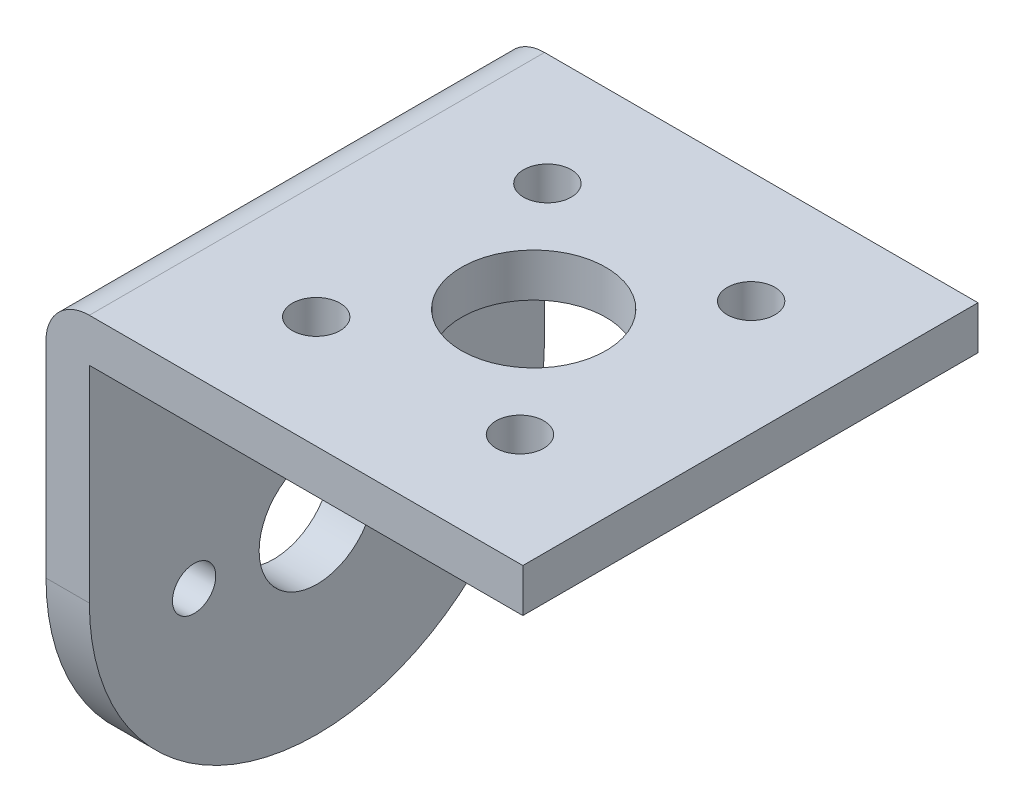
ISO-10303-21;
HEADER;
FILE_DESCRIPTION(('STEP AP214'),'2;1');
FILE_NAME('part.step','',(''),(''),'','','');
FILE_SCHEMA(('AUTOMOTIVE_DESIGN { 1 0 10303 214 1 1 1 1 }'));
ENDSEC;
DATA;
#1=APPLICATION_CONTEXT('core data for automotive mechanical design processes');
#2=APPLICATION_PROTOCOL_DEFINITION('international standard','automotive_design',2000,#1);
#3=PRODUCT_CONTEXT('',#1,'mechanical');
#4=PRODUCT('Part','Part','',(#3));
#5=PRODUCT_RELATED_PRODUCT_CATEGORY('part','',(#4));
#6=PRODUCT_DEFINITION_FORMATION('','',#4);
#7=PRODUCT_DEFINITION_CONTEXT('part definition',#1,'design');
#8=PRODUCT_DEFINITION('design','',#6,#7);
#9=PRODUCT_DEFINITION_SHAPE('','',#8);
#10=(LENGTH_UNIT() NAMED_UNIT(*) SI_UNIT(.MILLI.,.METRE.));
#11=(NAMED_UNIT(*) PLANE_ANGLE_UNIT() SI_UNIT($,.RADIAN.));
#12=(NAMED_UNIT(*) SI_UNIT($,.STERADIAN.) SOLID_ANGLE_UNIT());
#13=UNCERTAINTY_MEASURE_WITH_UNIT(LENGTH_MEASURE(1.E-05),#10,'distance_accuracy_value','');
#14=(GEOMETRIC_REPRESENTATION_CONTEXT(3) GLOBAL_UNCERTAINTY_ASSIGNED_CONTEXT((#13)) GLOBAL_UNIT_ASSIGNED_CONTEXT((#10,
#11,#12)) REPRESENTATION_CONTEXT('',''));
#15=CARTESIAN_POINT('',(0.,0.,0.));
#16=DIRECTION('',(0.,0.,1.));
#17=DIRECTION('',(1.,0.,0.));
#18=AXIS2_PLACEMENT_3D('',#15,#16,#17);
#19=CARTESIAN_POINT('',(0.,3.,0.));
#20=DIRECTION('',(0.,-1.,0.));
#21=DIRECTION('',(0.,0.,-1.));
#22=AXIS2_PLACEMENT_3D('',#19,#20,#21);
#23=PLANE('',#22);
#24=DIRECTION('',(-1.,0.,0.));
#25=VECTOR('',#24,1.);
#26=CARTESIAN_POINT('',(0.,3.,-31.5));
#27=LINE('',#26,#25);
#28=CARTESIAN_POINT('',(33.,3.,-31.5));
#29=VERTEX_POINT('',#28);
#30=CARTESIAN_POINT('',(3.,3.,-31.5));
#31=VERTEX_POINT('',#30);
#32=EDGE_CURVE('E170',#29,#31,#27,.T.);
#33=ORIENTED_EDGE('',*,*,#32,.T.);
#34=DIRECTION('',(0.,0.,1.));
#35=VECTOR('',#34,1.);
#36=CARTESIAN_POINT('',(3.,3.,0.));
#37=LINE('',#36,#35);
#38=CARTESIAN_POINT('',(3.,3.,0.));
#39=VERTEX_POINT('',#38);
#40=EDGE_CURVE('E203',#31,#39,#37,.T.);
#41=ORIENTED_EDGE('',*,*,#40,.T.);
#42=DIRECTION('',(1.,0.,0.));
#43=VECTOR('',#42,1.);
#44=CARTESIAN_POINT('',(0.,3.,0.));
#45=LINE('',#44,#43);
#46=CARTESIAN_POINT('',(33.,3.,0.));
#47=VERTEX_POINT('',#46);
#48=EDGE_CURVE('E165',#39,#47,#45,.T.);
#49=ORIENTED_EDGE('',*,*,#48,.T.);
#50=DIRECTION('',(0.,0.,-1.));
#51=VECTOR('',#50,1.);
#52=CARTESIAN_POINT('',(33.,3.,0.));
#53=LINE('',#52,#51);
#54=EDGE_CURVE('E167',#47,#29,#53,.T.);
#55=ORIENTED_EDGE('',*,*,#54,.T.);
#56=EDGE_LOOP('',(#33,#41,#49,#55));
#57=FACE_BOUND('',#56,.T.);
#58=CARTESIAN_POINT('',(18.,3.,-15.75));
#59=DIRECTION('',(0.,1.,0.));
#60=DIRECTION('',(0.,0.,1.));
#61=AXIS2_PLACEMENT_3D('',#58,#59,#60);
#62=CIRCLE('',#61,5.);
#63=CARTESIAN_POINT('',(18.,3.,-10.75));
#64=VERTEX_POINT('',#63);
#65=EDGE_CURVE('E122',#64,#64,#62,.T.);
#66=ORIENTED_EDGE('',*,*,#65,.F.);
#67=EDGE_LOOP('',(#66));
#68=FACE_BOUND('',#67,.T.);
#69=CARTESIAN_POINT('',(25.05,3.,-23.75));
#70=DIRECTION('',(0.,1.,0.));
#71=DIRECTION('',(0.,0.,1.));
#72=AXIS2_PLACEMENT_3D('',#69,#70,#71);
#73=CIRCLE('',#72,1.65);
#74=CARTESIAN_POINT('',(25.05,3.,-22.1));
#75=VERTEX_POINT('',#74);
#76=EDGE_CURVE('E155',#75,#75,#73,.T.);
#77=ORIENTED_EDGE('',*,*,#76,.F.);
#78=EDGE_LOOP('',(#77));
#79=FACE_BOUND('',#78,.T.);
#80=CARTESIAN_POINT('',(10.95,3.,-23.75));
#81=DIRECTION('',(0.,1.,0.));
#82=DIRECTION('',(0.,0.,1.));
#83=AXIS2_PLACEMENT_3D('',#80,#81,#82);
#84=CIRCLE('',#83,1.65);
#85=CARTESIAN_POINT('',(10.95,3.,-22.1));
#86=VERTEX_POINT('',#85);
#87=EDGE_CURVE('E149',#86,#86,#84,.T.);
#88=ORIENTED_EDGE('',*,*,#87,.F.);
#89=EDGE_LOOP('',(#88));
#90=FACE_BOUND('',#89,.T.);
#91=CARTESIAN_POINT('',(25.05,3.,-7.75));
#92=DIRECTION('',(0.,1.,0.));
#93=DIRECTION('',(0.,0.,-1.));
#94=AXIS2_PLACEMENT_3D('',#91,#92,#93);
#95=CIRCLE('',#94,1.65);
#96=CARTESIAN_POINT('',(25.05,3.,-9.4));
#97=VERTEX_POINT('',#96);
#98=EDGE_CURVE('E143',#97,#97,#95,.T.);
#99=ORIENTED_EDGE('',*,*,#98,.F.);
#100=EDGE_LOOP('',(#99));
#101=FACE_BOUND('',#100,.T.);
#102=CARTESIAN_POINT('',(10.95,3.,-7.75));
#103=DIRECTION('',(0.,1.,0.));
#104=DIRECTION('',(0.,0.,-1.));
#105=AXIS2_PLACEMENT_3D('',#102,#103,#104);
#106=CIRCLE('',#105,1.65);
#107=CARTESIAN_POINT('',(10.95,3.,-9.4));
#108=VERTEX_POINT('',#107);
#109=EDGE_CURVE('E137',#108,#108,#106,.T.);
#110=ORIENTED_EDGE('',*,*,#109,.F.);
#111=EDGE_LOOP('',(#110));
#112=FACE_BOUND('',#111,.T.);
#113=ADVANCED_FACE('F39',(#57,#68,#79,#90,#101,#112),#23,.F.);
#114=CARTESIAN_POINT('',(0.,0.,0.));
#115=DIRECTION('',(0.,-1.,0.));
#116=DIRECTION('',(0.,0.,-1.));
#117=AXIS2_PLACEMENT_3D('',#114,#115,#116);
#118=PLANE('',#117);
#119=DIRECTION('',(0.,0.,1.));
#120=VECTOR('',#119,1.);
#121=CARTESIAN_POINT('',(3.,0.,0.));
#122=LINE('',#121,#120);
#123=CARTESIAN_POINT('',(3.,0.,-31.5));
#124=VERTEX_POINT('',#123);
#125=CARTESIAN_POINT('',(3.,0.,0.));
#126=VERTEX_POINT('',#125);
#127=EDGE_CURVE('E112',#124,#126,#122,.T.);
#128=ORIENTED_EDGE('',*,*,#127,.F.);
#129=DIRECTION('',(-1.,0.,0.));
#130=VECTOR('',#129,1.);
#131=CARTESIAN_POINT('',(0.,0.,-31.5));
#132=LINE('',#131,#130);
#133=CARTESIAN_POINT('',(33.,0.,-31.5));
#134=VERTEX_POINT('',#133);
#135=EDGE_CURVE('E168',#134,#124,#132,.T.);
#136=ORIENTED_EDGE('',*,*,#135,.F.);
#137=DIRECTION('',(0.,0.,-1.));
#138=VECTOR('',#137,1.);
#139=CARTESIAN_POINT('',(33.,0.,0.));
#140=LINE('',#139,#138);
#141=CARTESIAN_POINT('',(33.,0.,0.));
#142=VERTEX_POINT('',#141);
#143=EDGE_CURVE('E121',#142,#134,#140,.T.);
#144=ORIENTED_EDGE('',*,*,#143,.F.);
#145=DIRECTION('',(1.,0.,0.));
#146=VECTOR('',#145,1.);
#147=CARTESIAN_POINT('',(0.,0.,0.));
#148=LINE('',#147,#146);
#149=EDGE_CURVE('E105',#126,#142,#148,.T.);
#150=ORIENTED_EDGE('',*,*,#149,.F.);
#151=EDGE_LOOP('',(#128,#136,#144,#150));
#152=FACE_BOUND('',#151,.T.);
#153=CARTESIAN_POINT('',(25.05,0.,-7.75));
#154=DIRECTION('',(0.,1.,0.));
#155=DIRECTION('',(0.,0.,-1.));
#156=AXIS2_PLACEMENT_3D('',#153,#154,#155);
#157=CIRCLE('',#156,1.65);
#158=CARTESIAN_POINT('',(25.05,0.,-9.4));
#159=VERTEX_POINT('',#158);
#160=EDGE_CURVE('E140',#159,#159,#157,.T.);
#161=ORIENTED_EDGE('',*,*,#160,.T.);
#162=EDGE_LOOP('',(#161));
#163=FACE_BOUND('',#162,.T.);
#164=CARTESIAN_POINT('',(25.05,0.,-23.75));
#165=DIRECTION('',(0.,1.,0.));
#166=DIRECTION('',(0.,0.,1.));
#167=AXIS2_PLACEMENT_3D('',#164,#165,#166);
#168=CIRCLE('',#167,1.65);
#169=CARTESIAN_POINT('',(25.05,0.,-22.1));
#170=VERTEX_POINT('',#169);
#171=EDGE_CURVE('E152',#170,#170,#168,.T.);
#172=ORIENTED_EDGE('',*,*,#171,.T.);
#173=EDGE_LOOP('',(#172));
#174=FACE_BOUND('',#173,.T.);
#175=CARTESIAN_POINT('',(18.,0.,-15.75));
#176=DIRECTION('',(0.,1.,0.));
#177=DIRECTION('',(0.,0.,1.));
#178=AXIS2_PLACEMENT_3D('',#175,#176,#177);
#179=CIRCLE('',#178,5.);
#180=CARTESIAN_POINT('',(18.,0.,-10.75));
#181=VERTEX_POINT('',#180);
#182=EDGE_CURVE('E158',#181,#181,#179,.T.);
#183=ORIENTED_EDGE('',*,*,#182,.T.);
#184=EDGE_LOOP('',(#183));
#185=FACE_BOUND('',#184,.T.);
#186=CARTESIAN_POINT('',(10.95,0.,-23.75));
#187=DIRECTION('',(0.,1.,0.));
#188=DIRECTION('',(0.,0.,1.));
#189=AXIS2_PLACEMENT_3D('',#186,#187,#188);
#190=CIRCLE('',#189,1.65);
#191=CARTESIAN_POINT('',(10.95,0.,-22.1));
#192=VERTEX_POINT('',#191);
#193=EDGE_CURVE('E146',#192,#192,#190,.T.);
#194=ORIENTED_EDGE('',*,*,#193,.T.);
#195=EDGE_LOOP('',(#194));
#196=FACE_BOUND('',#195,.T.);
#197=CARTESIAN_POINT('',(10.95,0.,-7.75));
#198=DIRECTION('',(0.,1.,0.));
#199=DIRECTION('',(0.,0.,-1.));
#200=AXIS2_PLACEMENT_3D('',#197,#198,#199);
#201=CIRCLE('',#200,1.65);
#202=CARTESIAN_POINT('',(10.95,0.,-9.4));
#203=VERTEX_POINT('',#202);
#204=EDGE_CURVE('E136',#203,#203,#201,.T.);
#205=ORIENTED_EDGE('',*,*,#204,.T.);
#206=EDGE_LOOP('',(#205));
#207=FACE_BOUND('',#206,.T.);
#208=ADVANCED_FACE('F117',(#152,#163,#174,#185,#196,#207),#118,.T.);
#209=CARTESIAN_POINT('',(0.,3.,0.));
#210=DIRECTION('',(1.,0.,0.));
#211=DIRECTION('',(0.,0.,-1.));
#212=AXIS2_PLACEMENT_3D('',#209,#210,#211);
#213=PLANE('',#212);
#214=CARTESIAN_POINT('',(0.,-17.,-24.25));
#215=DIRECTION('',(-1.,0.,0.));
#216=DIRECTION('',(0.,0.,1.));
#217=AXIS2_PLACEMENT_3D('',#214,#215,#216);
#218=CIRCLE('',#217,1.5);
#219=CARTESIAN_POINT('',(0.,-17.,-22.75));
#220=VERTEX_POINT('',#219);
#221=EDGE_CURVE('E188',#220,#220,#218,.T.);
#222=ORIENTED_EDGE('',*,*,#221,.F.);
#223=EDGE_LOOP('',(#222));
#224=FACE_BOUND('',#223,.T.);
#225=CARTESIAN_POINT('',(0.,-17.,-7.25));
#226=DIRECTION('',(-1.,0.,0.));
#227=DIRECTION('',(0.,0.,1.));
#228=AXIS2_PLACEMENT_3D('',#225,#226,#227);
#229=CIRCLE('',#228,1.5);
#230=CARTESIAN_POINT('',(0.,-17.,-5.75));
#231=VERTEX_POINT('',#230);
#232=EDGE_CURVE('E435',#231,#231,#229,.T.);
#233=ORIENTED_EDGE('',*,*,#232,.F.);
#234=EDGE_LOOP('',(#233));
#235=FACE_BOUND('',#234,.T.);
#236=CARTESIAN_POINT('',(0.,-17.,-15.75));
#237=DIRECTION('',(-1.,0.,0.));
#238=DIRECTION('',(0.,0.,1.));
#239=AXIS2_PLACEMENT_3D('',#236,#237,#238);
#240=CIRCLE('',#239,4.);
#241=CARTESIAN_POINT('',(0.,-17.,-11.75));
#242=VERTEX_POINT('',#241);
#243=EDGE_CURVE('E132',#242,#242,#240,.T.);
#244=ORIENTED_EDGE('',*,*,#243,.F.);
#245=EDGE_LOOP('',(#244));
#246=FACE_BOUND('',#245,.T.);
#247=DIRECTION('',(0.,-1.,0.));
#248=VECTOR('',#247,1.);
#249=CARTESIAN_POINT('',(0.,3.,0.));
#250=LINE('',#249,#248);
#251=CARTESIAN_POINT('',(0.,0.,0.));
#252=VERTEX_POINT('',#251);
#253=CARTESIAN_POINT('',(0.,-14.25,0.));
#254=VERTEX_POINT('',#253);
#255=EDGE_CURVE('E182',#252,#254,#250,.T.);
#256=ORIENTED_EDGE('',*,*,#255,.F.);
#257=DIRECTION('',(0.,0.,1.));
#258=VECTOR('',#257,1.);
#259=CARTESIAN_POINT('',(0.,0.,0.));
#260=LINE('',#259,#258);
#261=CARTESIAN_POINT('',(0.,0.,-31.5));
#262=VERTEX_POINT('',#261);
#263=EDGE_CURVE('E47',#252,#262,#260,.F.);
#264=ORIENTED_EDGE('',*,*,#263,.T.);
#265=DIRECTION('',(0.,-1.,0.));
#266=VECTOR('',#265,1.);
#267=CARTESIAN_POINT('',(0.,3.,-31.5));
#268=LINE('',#267,#266);
#269=CARTESIAN_POINT('',(0.,-14.25,-31.5));
#270=VERTEX_POINT('',#269);
#271=EDGE_CURVE('E172',#262,#270,#268,.T.);
#272=ORIENTED_EDGE('',*,*,#271,.T.);
#273=CARTESIAN_POINT('',(0.,-14.25,-15.75));
#274=DIRECTION('',(1.,0.,0.));
#275=DIRECTION('',(0.,0.,-1.));
#276=AXIS2_PLACEMENT_3D('',#273,#274,#275);
#277=CIRCLE('',#276,15.75);
#278=CARTESIAN_POINT('',(0.,-30.,-15.75));
#279=VERTEX_POINT('',#278);
#280=EDGE_CURVE('E184',#270,#279,#277,.F.);
#281=ORIENTED_EDGE('',*,*,#280,.T.);
#282=CARTESIAN_POINT('',(0.,-14.25,-15.75));
#283=DIRECTION('',(1.,0.,0.));
#284=DIRECTION('',(0.,0.,-1.));
#285=AXIS2_PLACEMENT_3D('',#282,#283,#284);
#286=CIRCLE('',#285,15.75);
#287=EDGE_CURVE('E192',#279,#254,#286,.F.);
#288=ORIENTED_EDGE('',*,*,#287,.T.);
#289=EDGE_LOOP('',(#256,#264,#272,#281,#288));
#290=FACE_BOUND('',#289,.T.);
#291=ADVANCED_FACE('F236',(#224,#235,#246,#290),#213,.F.);
#292=CARTESIAN_POINT('',(0.,3.,0.));
#293=DIRECTION('',(0.,0.,-1.));
#294=DIRECTION('',(-1.,0.,0.));
#295=AXIS2_PLACEMENT_3D('',#292,#293,#294);
#296=PLANE('',#295);
#297=ORIENTED_EDGE('',*,*,#48,.F.);
#298=CARTESIAN_POINT('',(3.,0.,0.));
#299=DIRECTION('',(0.,0.,-1.));
#300=DIRECTION('',(-1.,0.,0.));
#301=AXIS2_PLACEMENT_3D('',#298,#299,#300);
#302=CIRCLE('',#301,3.);
#303=EDGE_CURVE('E61',#39,#252,#302,.F.);
#304=ORIENTED_EDGE('',*,*,#303,.T.);
#305=ORIENTED_EDGE('',*,*,#255,.T.);
#306=DIRECTION('',(-1.,0.,0.));
#307=VECTOR('',#306,1.);
#308=CARTESIAN_POINT('',(3.,-14.25,0.));
#309=LINE('',#308,#307);
#310=CARTESIAN_POINT('',(3.,-14.25,0.));
#311=VERTEX_POINT('',#310);
#312=EDGE_CURVE('E108',#254,#311,#309,.F.);
#313=ORIENTED_EDGE('',*,*,#312,.T.);
#314=DIRECTION('',(0.,1.,0.));
#315=VECTOR('',#314,1.);
#316=CARTESIAN_POINT('',(3.,-30.,0.));
#317=LINE('',#316,#315);
#318=EDGE_CURVE('E101',#311,#126,#317,.T.);
#319=ORIENTED_EDGE('',*,*,#318,.T.);
#320=ORIENTED_EDGE('',*,*,#149,.T.);
#321=DIRECTION('',(0.,-1.,0.));
#322=VECTOR('',#321,1.);
#323=CARTESIAN_POINT('',(33.,3.,0.));
#324=LINE('',#323,#322);
#325=EDGE_CURVE('E180',#47,#142,#324,.T.);
#326=ORIENTED_EDGE('',*,*,#325,.F.);
#327=EDGE_LOOP('',(#297,#304,#305,#313,#319,#320,#326));
#328=FACE_BOUND('',#327,.T.);
#329=ADVANCED_FACE('F103',(#328),#296,.F.);
#330=CARTESIAN_POINT('',(33.,3.,0.));
#331=DIRECTION('',(-1.,0.,0.));
#332=DIRECTION('',(0.,0.,1.));
#333=AXIS2_PLACEMENT_3D('',#330,#331,#332);
#334=PLANE('',#333);
#335=ORIENTED_EDGE('',*,*,#143,.T.);
#336=DIRECTION('',(0.,-1.,0.));
#337=VECTOR('',#336,1.);
#338=CARTESIAN_POINT('',(33.,3.,-31.5));
#339=LINE('',#338,#337);
#340=EDGE_CURVE('E177',#29,#134,#339,.T.);
#341=ORIENTED_EDGE('',*,*,#340,.F.);
#342=ORIENTED_EDGE('',*,*,#54,.F.);
#343=ORIENTED_EDGE('',*,*,#325,.T.);
#344=EDGE_LOOP('',(#335,#341,#342,#343));
#345=FACE_BOUND('',#344,.T.);
#346=ADVANCED_FACE('F218',(#345),#334,.F.);
#347=CARTESIAN_POINT('',(0.,3.,-31.5));
#348=DIRECTION('',(0.,0.,1.));
#349=DIRECTION('',(1.,0.,0.));
#350=AXIS2_PLACEMENT_3D('',#347,#348,#349);
#351=PLANE('',#350);
#352=ORIENTED_EDGE('',*,*,#271,.F.);
#353=CARTESIAN_POINT('',(3.,0.,-31.5));
#354=DIRECTION('',(0.,0.,1.));
#355=DIRECTION('',(1.,0.,0.));
#356=AXIS2_PLACEMENT_3D('',#353,#354,#355);
#357=CIRCLE('',#356,3.);
#358=EDGE_CURVE('E11',#262,#31,#357,.F.);
#359=ORIENTED_EDGE('',*,*,#358,.T.);
#360=ORIENTED_EDGE('',*,*,#32,.F.);
#361=ORIENTED_EDGE('',*,*,#340,.T.);
#362=ORIENTED_EDGE('',*,*,#135,.T.);
#363=DIRECTION('',(0.,1.,0.));
#364=VECTOR('',#363,1.);
#365=CARTESIAN_POINT('',(3.,-30.,-31.5));
#366=LINE('',#365,#364);
#367=CARTESIAN_POINT('',(3.,-14.25,-31.5));
#368=VERTEX_POINT('',#367);
#369=EDGE_CURVE('E111',#368,#124,#366,.T.);
#370=ORIENTED_EDGE('',*,*,#369,.F.);
#371=DIRECTION('',(1.,0.,0.));
#372=VECTOR('',#371,1.);
#373=CARTESIAN_POINT('',(0.,-14.25,-31.5));
#374=LINE('',#373,#372);
#375=EDGE_CURVE('E200',#368,#270,#374,.F.);
#376=ORIENTED_EDGE('',*,*,#375,.T.);
#377=EDGE_LOOP('',(#352,#359,#360,#361,#362,#370,#376));
#378=FACE_BOUND('',#377,.T.);
#379=ADVANCED_FACE('F220',(#378),#351,.F.);
#380=CARTESIAN_POINT('',(18.,3.,-15.75));
#381=DIRECTION('',(0.,-1.,0.));
#382=DIRECTION('',(0.,0.,-1.));
#383=AXIS2_PLACEMENT_3D('',#380,#381,#382);
#384=CYLINDRICAL_SURFACE('',#383,5.);
#385=ORIENTED_EDGE('',*,*,#65,.T.);
#386=EDGE_LOOP('',(#385));
#387=FACE_BOUND('',#386,.T.);
#388=ORIENTED_EDGE('',*,*,#182,.F.);
#389=EDGE_LOOP('',(#388));
#390=FACE_BOUND('',#389,.T.);
#391=ADVANCED_FACE('F239',(#387,#390),#384,.F.);
#392=CARTESIAN_POINT('',(25.05,3.,-23.75));
#393=DIRECTION('',(0.,-1.,0.));
#394=DIRECTION('',(0.,0.,-1.));
#395=AXIS2_PLACEMENT_3D('',#392,#393,#394);
#396=CYLINDRICAL_SURFACE('',#395,1.65);
#397=ORIENTED_EDGE('',*,*,#76,.T.);
#398=EDGE_LOOP('',(#397));
#399=FACE_BOUND('',#398,.T.);
#400=ORIENTED_EDGE('',*,*,#171,.F.);
#401=EDGE_LOOP('',(#400));
#402=FACE_BOUND('',#401,.T.);
#403=ADVANCED_FACE('F287',(#399,#402),#396,.F.);
#404=CARTESIAN_POINT('',(10.95,3.,-23.75));
#405=DIRECTION('',(0.,-1.,0.));
#406=DIRECTION('',(0.,0.,-1.));
#407=AXIS2_PLACEMENT_3D('',#404,#405,#406);
#408=CYLINDRICAL_SURFACE('',#407,1.65);
#409=ORIENTED_EDGE('',*,*,#87,.T.);
#410=EDGE_LOOP('',(#409));
#411=FACE_BOUND('',#410,.T.);
#412=ORIENTED_EDGE('',*,*,#193,.F.);
#413=EDGE_LOOP('',(#412));
#414=FACE_BOUND('',#413,.T.);
#415=ADVANCED_FACE('F284',(#411,#414),#408,.F.);
#416=CARTESIAN_POINT('',(25.05,3.,-7.75));
#417=DIRECTION('',(0.,-1.,0.));
#418=DIRECTION('',(0.,0.,-1.));
#419=AXIS2_PLACEMENT_3D('',#416,#417,#418);
#420=CYLINDRICAL_SURFACE('',#419,1.65);
#421=ORIENTED_EDGE('',*,*,#98,.T.);
#422=EDGE_LOOP('',(#421));
#423=FACE_BOUND('',#422,.T.);
#424=ORIENTED_EDGE('',*,*,#160,.F.);
#425=EDGE_LOOP('',(#424));
#426=FACE_BOUND('',#425,.T.);
#427=ADVANCED_FACE('F280',(#423,#426),#420,.F.);
#428=CARTESIAN_POINT('',(10.95,3.,-7.75));
#429=DIRECTION('',(0.,-1.,0.));
#430=DIRECTION('',(0.,0.,-1.));
#431=AXIS2_PLACEMENT_3D('',#428,#429,#430);
#432=CYLINDRICAL_SURFACE('',#431,1.65);
#433=ORIENTED_EDGE('',*,*,#109,.T.);
#434=EDGE_LOOP('',(#433));
#435=FACE_BOUND('',#434,.T.);
#436=ORIENTED_EDGE('',*,*,#204,.F.);
#437=EDGE_LOOP('',(#436));
#438=FACE_BOUND('',#437,.T.);
#439=ADVANCED_FACE('F276',(#435,#438),#432,.F.);
#440=CARTESIAN_POINT('',(3.,-30.,0.));
#441=DIRECTION('',(-1.,0.,0.));
#442=DIRECTION('',(0.,0.,1.));
#443=AXIS2_PLACEMENT_3D('',#440,#441,#442);
#444=PLANE('',#443);
#445=CARTESIAN_POINT('',(3.,-17.,-24.25));
#446=DIRECTION('',(-1.,0.,0.));
#447=DIRECTION('',(0.,0.,1.));
#448=AXIS2_PLACEMENT_3D('',#445,#446,#447);
#449=CIRCLE('',#448,1.5);
#450=CARTESIAN_POINT('',(3.,-17.,-22.75));
#451=VERTEX_POINT('',#450);
#452=EDGE_CURVE('E126',#451,#451,#449,.T.);
#453=ORIENTED_EDGE('',*,*,#452,.T.);
#454=EDGE_LOOP('',(#453));
#455=FACE_BOUND('',#454,.T.);
#456=CARTESIAN_POINT('',(3.,-17.,-7.25));
#457=DIRECTION('',(-1.,0.,0.));
#458=DIRECTION('',(0.,0.,1.));
#459=AXIS2_PLACEMENT_3D('',#456,#457,#458);
#460=CIRCLE('',#459,1.5);
#461=CARTESIAN_POINT('',(3.,-17.,-5.75));
#462=VERTEX_POINT('',#461);
#463=EDGE_CURVE('E129',#462,#462,#460,.T.);
#464=ORIENTED_EDGE('',*,*,#463,.T.);
#465=EDGE_LOOP('',(#464));
#466=FACE_BOUND('',#465,.T.);
#467=CARTESIAN_POINT('',(3.,-17.,-15.75));
#468=DIRECTION('',(-1.,0.,0.));
#469=DIRECTION('',(0.,0.,1.));
#470=AXIS2_PLACEMENT_3D('',#467,#468,#469);
#471=CIRCLE('',#470,4.);
#472=CARTESIAN_POINT('',(3.,-17.,-11.75));
#473=VERTEX_POINT('',#472);
#474=EDGE_CURVE('E185',#473,#473,#471,.T.);
#475=ORIENTED_EDGE('',*,*,#474,.T.);
#476=EDGE_LOOP('',(#475));
#477=FACE_BOUND('',#476,.T.);
#478=ORIENTED_EDGE('',*,*,#318,.F.);
#479=CARTESIAN_POINT('',(3.,-14.25,-15.75));
#480=DIRECTION('',(-1.,0.,0.));
#481=DIRECTION('',(0.,0.,1.));
#482=AXIS2_PLACEMENT_3D('',#479,#480,#481);
#483=CIRCLE('',#482,15.75);
#484=CARTESIAN_POINT('',(3.,-30.,-15.75));
#485=VERTEX_POINT('',#484);
#486=EDGE_CURVE('E198',#311,#485,#483,.F.);
#487=ORIENTED_EDGE('',*,*,#486,.T.);
#488=CARTESIAN_POINT('',(3.,-14.25,-15.75));
#489=DIRECTION('',(-1.,0.,0.));
#490=DIRECTION('',(0.,0.,1.));
#491=AXIS2_PLACEMENT_3D('',#488,#489,#490);
#492=CIRCLE('',#491,15.75);
#493=EDGE_CURVE('E196',#485,#368,#492,.F.);
#494=ORIENTED_EDGE('',*,*,#493,.T.);
#495=ORIENTED_EDGE('',*,*,#369,.T.);
#496=ORIENTED_EDGE('',*,*,#127,.T.);
#497=EDGE_LOOP('',(#478,#487,#494,#495,#496));
#498=FACE_BOUND('',#497,.T.);
#499=ADVANCED_FACE('F124',(#455,#466,#477,#498),#444,.F.);
#500=CARTESIAN_POINT('',(30.,-17.,-15.75));
#501=DIRECTION('',(-1.,0.,0.));
#502=DIRECTION('',(0.,0.,1.));
#503=AXIS2_PLACEMENT_3D('',#500,#501,#502);
#504=CYLINDRICAL_SURFACE('',#503,4.);
#505=ORIENTED_EDGE('',*,*,#243,.T.);
#506=EDGE_LOOP('',(#505));
#507=FACE_BOUND('',#506,.T.);
#508=ORIENTED_EDGE('',*,*,#474,.F.);
#509=EDGE_LOOP('',(#508));
#510=FACE_BOUND('',#509,.T.);
#511=ADVANCED_FACE('F266',(#507,#510),#504,.F.);
#512=CARTESIAN_POINT('',(30.,-17.,-7.25));
#513=DIRECTION('',(-1.,0.,0.));
#514=DIRECTION('',(0.,0.,1.));
#515=AXIS2_PLACEMENT_3D('',#512,#513,#514);
#516=CYLINDRICAL_SURFACE('',#515,1.5);
#517=ORIENTED_EDGE('',*,*,#232,.T.);
#518=EDGE_LOOP('',(#517));
#519=FACE_BOUND('',#518,.T.);
#520=ORIENTED_EDGE('',*,*,#463,.F.);
#521=EDGE_LOOP('',(#520));
#522=FACE_BOUND('',#521,.T.);
#523=ADVANCED_FACE('F255',(#519,#522),#516,.F.);
#524=CARTESIAN_POINT('',(30.,-17.,-24.25));
#525=DIRECTION('',(-1.,0.,0.));
#526=DIRECTION('',(0.,0.,1.));
#527=AXIS2_PLACEMENT_3D('',#524,#525,#526);
#528=CYLINDRICAL_SURFACE('',#527,1.5);
#529=ORIENTED_EDGE('',*,*,#221,.T.);
#530=EDGE_LOOP('',(#529));
#531=FACE_BOUND('',#530,.T.);
#532=ORIENTED_EDGE('',*,*,#452,.F.);
#533=EDGE_LOOP('',(#532));
#534=FACE_BOUND('',#533,.T.);
#535=ADVANCED_FACE('F249',(#531,#534),#528,.F.);
#536=CARTESIAN_POINT('',(0.,-14.25,-15.75));
#537=DIRECTION('',(-1.,0.,0.));
#538=DIRECTION('',(0.,0.,1.));
#539=AXIS2_PLACEMENT_3D('',#536,#537,#538);
#540=CYLINDRICAL_SURFACE('',#539,15.75);
#541=ORIENTED_EDGE('',*,*,#375,.F.);
#542=ORIENTED_EDGE('',*,*,#493,.F.);
#543=DIRECTION('',(1.,0.,0.));
#544=VECTOR('',#543,1.);
#545=CARTESIAN_POINT('',(3.,-30.,-15.75));
#546=LINE('',#545,#544);
#547=EDGE_CURVE('E204',#279,#485,#546,.T.);
#548=ORIENTED_EDGE('',*,*,#547,.F.);
#549=ORIENTED_EDGE('',*,*,#280,.F.);
#550=EDGE_LOOP('',(#541,#542,#548,#549));
#551=FACE_BOUND('',#550,.T.);
#552=ADVANCED_FACE('F227',(#551),#540,.T.);
#553=CARTESIAN_POINT('',(0.,-14.25,-15.75));
#554=DIRECTION('',(1.,0.,0.));
#555=DIRECTION('',(0.,0.,-1.));
#556=AXIS2_PLACEMENT_3D('',#553,#554,#555);
#557=CYLINDRICAL_SURFACE('',#556,15.75);
#558=ORIENTED_EDGE('',*,*,#486,.F.);
#559=ORIENTED_EDGE('',*,*,#312,.F.);
#560=ORIENTED_EDGE('',*,*,#287,.F.);
#561=ORIENTED_EDGE('',*,*,#547,.T.);
#562=EDGE_LOOP('',(#558,#559,#560,#561));
#563=FACE_BOUND('',#562,.T.);
#564=ADVANCED_FACE('F222',(#563),#557,.T.);
#565=CARTESIAN_POINT('',(3.,0.,0.));
#566=DIRECTION('',(0.,0.,1.));
#567=DIRECTION('',(1.,0.,0.));
#568=AXIS2_PLACEMENT_3D('',#565,#566,#567);
#569=CYLINDRICAL_SURFACE('',#568,3.);
#570=ORIENTED_EDGE('',*,*,#358,.F.);
#571=ORIENTED_EDGE('',*,*,#263,.F.);
#572=ORIENTED_EDGE('',*,*,#303,.F.);
#573=ORIENTED_EDGE('',*,*,#40,.F.);
#574=EDGE_LOOP('',(#570,#571,#572,#573));
#575=FACE_BOUND('',#574,.T.);
#576=ADVANCED_FACE('F41',(#575),#569,.T.);
#577=CLOSED_SHELL('',(#113,#208,#291,#329,#346,#379,#391,#403,#415,#427,#439,#499,#511,#523,
#535,#552,#564,#576));
#578=MANIFOLD_SOLID_BREP('B2',#577);
#579=ADVANCED_BREP_SHAPE_REPRESENTATION('',(#18,#578),#14);
#580=SHAPE_DEFINITION_REPRESENTATION(#9,#579);
ENDSEC;
END-ISO-10303-21;
